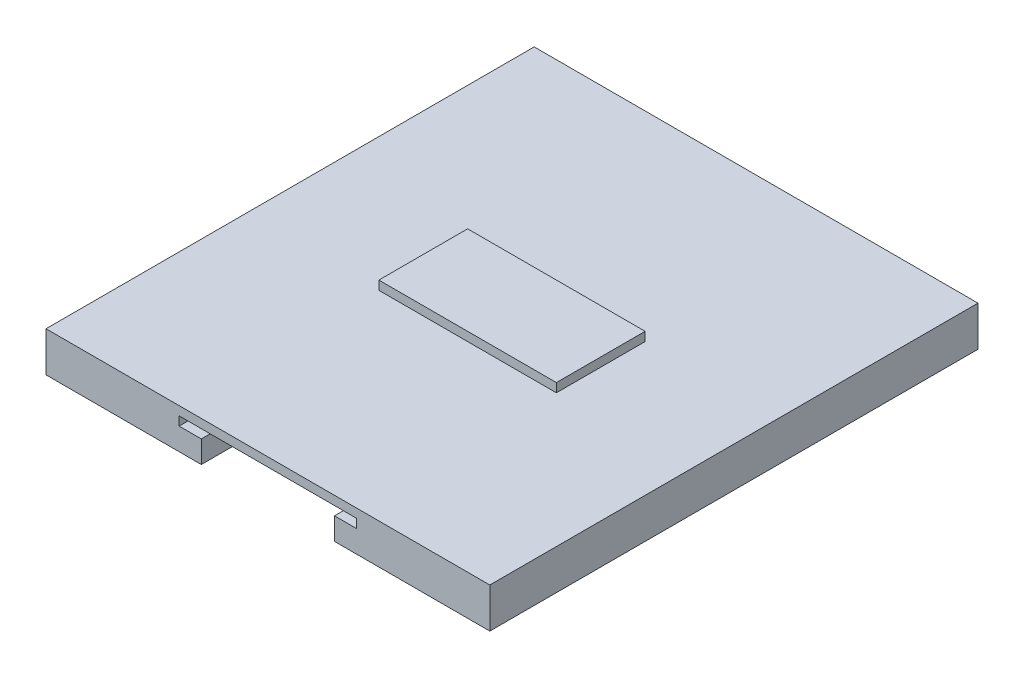
ISO-10303-21;
HEADER;
FILE_DESCRIPTION(('STEP AP214'),'2;1');
FILE_NAME('part.step','',(''),(''),'','','');
FILE_SCHEMA(('AUTOMOTIVE_DESIGN { 1 0 10303 214 1 1 1 1 }'));
ENDSEC;
DATA;
#1=APPLICATION_CONTEXT('core data for automotive mechanical design processes');
#2=APPLICATION_PROTOCOL_DEFINITION('international standard','automotive_design',2000,#1);
#3=PRODUCT_CONTEXT('',#1,'mechanical');
#4=PRODUCT('Part','Part','',(#3));
#5=PRODUCT_RELATED_PRODUCT_CATEGORY('part','',(#4));
#6=PRODUCT_DEFINITION_FORMATION('','',#4);
#7=PRODUCT_DEFINITION_CONTEXT('part definition',#1,'design');
#8=PRODUCT_DEFINITION('design','',#6,#7);
#9=PRODUCT_DEFINITION_SHAPE('','',#8);
#10=(LENGTH_UNIT() NAMED_UNIT(*) SI_UNIT(.MILLI.,.METRE.));
#11=(NAMED_UNIT(*) PLANE_ANGLE_UNIT() SI_UNIT($,.RADIAN.));
#12=(NAMED_UNIT(*) SI_UNIT($,.STERADIAN.) SOLID_ANGLE_UNIT());
#13=UNCERTAINTY_MEASURE_WITH_UNIT(LENGTH_MEASURE(1.E-05),#10,'distance_accuracy_value','');
#14=(GEOMETRIC_REPRESENTATION_CONTEXT(3) GLOBAL_UNCERTAINTY_ASSIGNED_CONTEXT((#13)) GLOBAL_UNIT_ASSIGNED_CONTEXT((#10,
#11,#12)) REPRESENTATION_CONTEXT('',''));
#15=CARTESIAN_POINT('',(0.,0.,0.));
#16=DIRECTION('',(0.,0.,1.));
#17=DIRECTION('',(1.,0.,0.));
#18=AXIS2_PLACEMENT_3D('',#15,#16,#17);
#19=CARTESIAN_POINT('',(-50.,8.99999999999999,55.));
#20=DIRECTION('',(0.,1.,0.));
#21=DIRECTION('',(0.,0.,1.));
#22=AXIS2_PLACEMENT_3D('',#19,#20,#21);
#23=PLANE('',#22);
#24=DIRECTION('',(1.,0.,0.));
#25=VECTOR('',#24,1.);
#26=CARTESIAN_POINT('',(-50.,8.99999999999999,-55.));
#27=LINE('',#26,#25);
#28=CARTESIAN_POINT('',(-50.,8.99999999999999,-55.));
#29=VERTEX_POINT('',#28);
#30=CARTESIAN_POINT('',(50.,8.99999999999999,-55.));
#31=VERTEX_POINT('',#30);
#32=EDGE_CURVE('E256',#29,#31,#27,.T.);
#33=ORIENTED_EDGE('',*,*,#32,.F.);
#34=DIRECTION('',(0.,0.,-1.));
#35=VECTOR('',#34,1.);
#36=CARTESIAN_POINT('',(-50.,8.99999999999999,55.));
#37=LINE('',#36,#35);
#38=CARTESIAN_POINT('',(-50.,8.99999999999999,55.));
#39=VERTEX_POINT('',#38);
#40=EDGE_CURVE('E43',#39,#29,#37,.T.);
#41=ORIENTED_EDGE('',*,*,#40,.F.);
#42=DIRECTION('',(1.,0.,0.));
#43=VECTOR('',#42,1.);
#44=CARTESIAN_POINT('',(-50.,8.99999999999999,55.));
#45=LINE('',#44,#43);
#46=CARTESIAN_POINT('',(50.,8.99999999999999,55.));
#47=VERTEX_POINT('',#46);
#48=EDGE_CURVE('E243',#39,#47,#45,.T.);
#49=ORIENTED_EDGE('',*,*,#48,.T.);
#50=DIRECTION('',(0.,0.,-1.));
#51=VECTOR('',#50,1.);
#52=CARTESIAN_POINT('',(50.,8.99999999999999,55.));
#53=LINE('',#52,#51);
#54=EDGE_CURVE('E265',#47,#31,#53,.T.);
#55=ORIENTED_EDGE('',*,*,#54,.T.);
#56=EDGE_LOOP('',(#33,#41,#49,#55));
#57=FACE_BOUND('',#56,.T.);
#58=DIRECTION('',(1.,0.,0.));
#59=VECTOR('',#58,1.);
#60=CARTESIAN_POINT('',(-20.,8.99999999999999,10.));
#61=LINE('',#60,#59);
#62=CARTESIAN_POINT('',(-20.,8.99999999999999,10.));
#63=VERTEX_POINT('',#62);
#64=CARTESIAN_POINT('',(20.,8.99999999999999,10.));
#65=VERTEX_POINT('',#64);
#66=EDGE_CURVE('E520',#63,#65,#61,.T.);
#67=ORIENTED_EDGE('',*,*,#66,.F.);
#68=DIRECTION('',(0.,0.,1.));
#69=VECTOR('',#68,1.);
#70=CARTESIAN_POINT('',(-20.,8.99999999999999,-10.));
#71=LINE('',#70,#69);
#72=CARTESIAN_POINT('',(-20.,8.99999999999999,-10.));
#73=VERTEX_POINT('',#72);
#74=EDGE_CURVE('E177',#73,#63,#71,.T.);
#75=ORIENTED_EDGE('',*,*,#74,.F.);
#76=DIRECTION('',(-1.,0.,0.));
#77=VECTOR('',#76,1.);
#78=CARTESIAN_POINT('',(-20.,8.99999999999999,-10.));
#79=LINE('',#78,#77);
#80=CARTESIAN_POINT('',(20.,8.99999999999999,-10.));
#81=VERTEX_POINT('',#80);
#82=EDGE_CURVE('E173',#81,#73,#79,.T.);
#83=ORIENTED_EDGE('',*,*,#82,.F.);
#84=DIRECTION('',(0.,0.,-1.));
#85=VECTOR('',#84,1.);
#86=CARTESIAN_POINT('',(20.,8.99999999999999,-10.));
#87=LINE('',#86,#85);
#88=EDGE_CURVE('E517',#65,#81,#87,.T.);
#89=ORIENTED_EDGE('',*,*,#88,.F.);
#90=EDGE_LOOP('',(#67,#75,#83,#89));
#91=FACE_BOUND('',#90,.T.);
#92=ADVANCED_FACE('F39',(#57,#91),#23,.T.);
#93=CARTESIAN_POINT('',(-50.,0.,55.));
#94=DIRECTION('',(0.,-1.,0.));
#95=DIRECTION('',(0.,0.,-1.));
#96=AXIS2_PLACEMENT_3D('',#93,#94,#95);
#97=PLANE('',#96);
#98=DIRECTION('',(0.,0.,-1.));
#99=VECTOR('',#98,1.);
#100=CARTESIAN_POINT('',(-15.,0.,55.));
#101=LINE('',#100,#99);
#102=CARTESIAN_POINT('',(-15.,0.,55.));
#103=VERTEX_POINT('',#102);
#104=CARTESIAN_POINT('',(-15.,0.,-55.));
#105=VERTEX_POINT('',#104);
#106=EDGE_CURVE('E226',#103,#105,#101,.T.);
#107=ORIENTED_EDGE('',*,*,#106,.F.);
#108=DIRECTION('',(-1.,0.,0.));
#109=VECTOR('',#108,1.);
#110=CARTESIAN_POINT('',(-50.,0.,55.));
#111=LINE('',#110,#109);
#112=CARTESIAN_POINT('',(-50.,0.,55.));
#113=VERTEX_POINT('',#112);
#114=EDGE_CURVE('E250',#103,#113,#111,.T.);
#115=ORIENTED_EDGE('',*,*,#114,.T.);
#116=DIRECTION('',(0.,0.,-1.));
#117=VECTOR('',#116,1.);
#118=CARTESIAN_POINT('',(-50.,0.,55.));
#119=LINE('',#118,#117);
#120=CARTESIAN_POINT('',(-50.,0.,-55.));
#121=VERTEX_POINT('',#120);
#122=EDGE_CURVE('E11',#113,#121,#119,.T.);
#123=ORIENTED_EDGE('',*,*,#122,.T.);
#124=DIRECTION('',(-1.,0.,0.));
#125=VECTOR('',#124,1.);
#126=CARTESIAN_POINT('',(-50.,0.,-55.));
#127=LINE('',#126,#125);
#128=EDGE_CURVE('E262',#105,#121,#127,.T.);
#129=ORIENTED_EDGE('',*,*,#128,.F.);
#130=EDGE_LOOP('',(#107,#115,#123,#129));
#131=FACE_BOUND('',#130,.T.);
#132=ADVANCED_FACE('F281',(#131),#97,.T.);
#133=CARTESIAN_POINT('',(-50.,8.99999999999999,55.));
#134=DIRECTION('',(-1.,0.,0.));
#135=DIRECTION('',(0.,0.,1.));
#136=AXIS2_PLACEMENT_3D('',#133,#134,#135);
#137=PLANE('',#136);
#138=DIRECTION('',(0.,1.,0.));
#139=VECTOR('',#138,1.);
#140=CARTESIAN_POINT('',(-50.,8.99999999999999,-55.));
#141=LINE('',#140,#139);
#142=EDGE_CURVE('E225',#121,#29,#141,.T.);
#143=ORIENTED_EDGE('',*,*,#142,.F.);
#144=ORIENTED_EDGE('',*,*,#122,.F.);
#145=DIRECTION('',(0.,1.,0.));
#146=VECTOR('',#145,1.);
#147=CARTESIAN_POINT('',(-50.,8.99999999999999,55.));
#148=LINE('',#147,#146);
#149=EDGE_CURVE('E240',#113,#39,#148,.T.);
#150=ORIENTED_EDGE('',*,*,#149,.T.);
#151=ORIENTED_EDGE('',*,*,#40,.T.);
#152=EDGE_LOOP('',(#143,#144,#150,#151));
#153=FACE_BOUND('',#152,.T.);
#154=ADVANCED_FACE('F41',(#153),#137,.T.);
#155=DIRECTION('',(0.,0.,-1.));
#156=VECTOR('',#155,1.);
#157=CARTESIAN_POINT('',(15.,0.,55.));
#158=LINE('',#157,#156);
#159=CARTESIAN_POINT('',(15.,0.,55.));
#160=VERTEX_POINT('',#159);
#161=CARTESIAN_POINT('',(15.,0.,-55.));
#162=VERTEX_POINT('',#161);
#163=EDGE_CURVE('E228',#160,#162,#158,.T.);
#164=ORIENTED_EDGE('',*,*,#163,.T.);
#165=CARTESIAN_POINT('',(50.,0.,-55.));
#166=VERTEX_POINT('',#165);
#167=EDGE_CURVE('E244',#166,#162,#127,.T.);
#168=ORIENTED_EDGE('',*,*,#167,.F.);
#169=DIRECTION('',(0.,0.,-1.));
#170=VECTOR('',#169,1.);
#171=CARTESIAN_POINT('',(50.,0.,55.));
#172=LINE('',#171,#170);
#173=CARTESIAN_POINT('',(50.,0.,55.));
#174=VERTEX_POINT('',#173);
#175=EDGE_CURVE('E48',#174,#166,#172,.T.);
#176=ORIENTED_EDGE('',*,*,#175,.F.);
#177=EDGE_CURVE('E251',#174,#160,#111,.T.);
#178=ORIENTED_EDGE('',*,*,#177,.T.);
#179=EDGE_LOOP('',(#164,#168,#176,#178));
#180=FACE_BOUND('',#179,.T.);
#181=ADVANCED_FACE('F292',(#180),#97,.T.);
#182=CARTESIAN_POINT('',(50.,8.99999999999999,55.));
#183=DIRECTION('',(1.,0.,0.));
#184=DIRECTION('',(0.,0.,-1.));
#185=AXIS2_PLACEMENT_3D('',#182,#183,#184);
#186=PLANE('',#185);
#187=DIRECTION('',(0.,-1.,0.));
#188=VECTOR('',#187,1.);
#189=CARTESIAN_POINT('',(50.,8.99999999999999,-55.));
#190=LINE('',#189,#188);
#191=EDGE_CURVE('E259',#31,#166,#190,.T.);
#192=ORIENTED_EDGE('',*,*,#191,.F.);
#193=ORIENTED_EDGE('',*,*,#54,.F.);
#194=DIRECTION('',(0.,-1.,0.));
#195=VECTOR('',#194,1.);
#196=CARTESIAN_POINT('',(50.,8.99999999999999,55.));
#197=LINE('',#196,#195);
#198=EDGE_CURVE('E247',#47,#174,#197,.T.);
#199=ORIENTED_EDGE('',*,*,#198,.T.);
#200=ORIENTED_EDGE('',*,*,#175,.T.);
#201=EDGE_LOOP('',(#192,#193,#199,#200));
#202=FACE_BOUND('',#201,.T.);
#203=ADVANCED_FACE('F288',(#202),#186,.T.);
#204=CARTESIAN_POINT('',(-50.,0.,55.));
#205=DIRECTION('',(0.,0.,1.));
#206=DIRECTION('',(1.,0.,0.));
#207=AXIS2_PLACEMENT_3D('',#204,#205,#206);
#208=PLANE('',#207);
#209=DIRECTION('',(0.,1.,0.));
#210=VECTOR('',#209,1.);
#211=CARTESIAN_POINT('',(-15.,0.,55.));
#212=LINE('',#211,#210);
#213=CARTESIAN_POINT('',(-15.,5.,55.));
#214=VERTEX_POINT('',#213);
#215=EDGE_CURVE('E204',#103,#214,#212,.T.);
#216=ORIENTED_EDGE('',*,*,#215,.T.);
#217=DIRECTION('',(-1.,0.,0.));
#218=VECTOR('',#217,1.);
#219=CARTESIAN_POINT('',(-15.,5.,55.));
#220=LINE('',#219,#218);
#221=CARTESIAN_POINT('',(-20.,5.,55.));
#222=VERTEX_POINT('',#221);
#223=EDGE_CURVE('E185',#214,#222,#220,.T.);
#224=ORIENTED_EDGE('',*,*,#223,.T.);
#225=DIRECTION('',(0.,1.,0.));
#226=VECTOR('',#225,1.);
#227=CARTESIAN_POINT('',(-20.,5.,55.));
#228=LINE('',#227,#226);
#229=CARTESIAN_POINT('',(-20.,7.,55.));
#230=VERTEX_POINT('',#229);
#231=EDGE_CURVE('E188',#222,#230,#228,.T.);
#232=ORIENTED_EDGE('',*,*,#231,.T.);
#233=DIRECTION('',(1.,0.,0.));
#234=VECTOR('',#233,1.);
#235=CARTESIAN_POINT('',(-20.,7.,55.));
#236=LINE('',#235,#234);
#237=CARTESIAN_POINT('',(20.,7.,55.));
#238=VERTEX_POINT('',#237);
#239=EDGE_CURVE('E192',#230,#238,#236,.T.);
#240=ORIENTED_EDGE('',*,*,#239,.T.);
#241=DIRECTION('',(0.,-1.,0.));
#242=VECTOR('',#241,1.);
#243=CARTESIAN_POINT('',(20.,7.,55.));
#244=LINE('',#243,#242);
#245=CARTESIAN_POINT('',(20.,5.,55.));
#246=VERTEX_POINT('',#245);
#247=EDGE_CURVE('E195',#238,#246,#244,.T.);
#248=ORIENTED_EDGE('',*,*,#247,.T.);
#249=DIRECTION('',(-1.,0.,0.));
#250=VECTOR('',#249,1.);
#251=CARTESIAN_POINT('',(20.,5.,55.));
#252=LINE('',#251,#250);
#253=CARTESIAN_POINT('',(15.,5.,55.));
#254=VERTEX_POINT('',#253);
#255=EDGE_CURVE('E198',#246,#254,#252,.T.);
#256=ORIENTED_EDGE('',*,*,#255,.T.);
#257=DIRECTION('',(0.,-1.,0.));
#258=VECTOR('',#257,1.);
#259=CARTESIAN_POINT('',(15.,5.,55.));
#260=LINE('',#259,#258);
#261=EDGE_CURVE('E201',#254,#160,#260,.T.);
#262=ORIENTED_EDGE('',*,*,#261,.T.);
#263=ORIENTED_EDGE('',*,*,#177,.F.);
#264=ORIENTED_EDGE('',*,*,#198,.F.);
#265=ORIENTED_EDGE('',*,*,#48,.F.);
#266=ORIENTED_EDGE('',*,*,#149,.F.);
#267=ORIENTED_EDGE('',*,*,#114,.F.);
#268=EDGE_LOOP('',(#216,#224,#232,#240,#248,#256,#262,#263,#264,#265,#266,#267));
#269=FACE_BOUND('',#268,.T.);
#270=ADVANCED_FACE('F284',(#269),#208,.T.);
#271=CARTESIAN_POINT('',(-50.,0.,-55.));
#272=DIRECTION('',(0.,0.,1.));
#273=DIRECTION('',(1.,0.,0.));
#274=AXIS2_PLACEMENT_3D('',#271,#272,#273);
#275=PLANE('',#274);
#276=DIRECTION('',(-1.,0.,0.));
#277=VECTOR('',#276,1.);
#278=CARTESIAN_POINT('',(-15.,5.,-55.));
#279=LINE('',#278,#277);
#280=CARTESIAN_POINT('',(-15.,5.,-55.));
#281=VERTEX_POINT('',#280);
#282=CARTESIAN_POINT('',(-20.,5.,-55.));
#283=VERTEX_POINT('',#282);
#284=EDGE_CURVE('E64',#281,#283,#279,.T.);
#285=ORIENTED_EDGE('',*,*,#284,.F.);
#286=DIRECTION('',(0.,1.,0.));
#287=VECTOR('',#286,1.);
#288=CARTESIAN_POINT('',(-15.,0.,-55.));
#289=LINE('',#288,#287);
#290=EDGE_CURVE('E189',#105,#281,#289,.T.);
#291=ORIENTED_EDGE('',*,*,#290,.F.);
#292=ORIENTED_EDGE('',*,*,#128,.T.);
#293=ORIENTED_EDGE('',*,*,#142,.T.);
#294=ORIENTED_EDGE('',*,*,#32,.T.);
#295=ORIENTED_EDGE('',*,*,#191,.T.);
#296=ORIENTED_EDGE('',*,*,#167,.T.);
#297=DIRECTION('',(0.,-1.,0.));
#298=VECTOR('',#297,1.);
#299=CARTESIAN_POINT('',(15.,5.,-55.));
#300=LINE('',#299,#298);
#301=CARTESIAN_POINT('',(15.,5.,-55.));
#302=VERTEX_POINT('',#301);
#303=EDGE_CURVE('E219',#302,#162,#300,.T.);
#304=ORIENTED_EDGE('',*,*,#303,.F.);
#305=DIRECTION('',(-1.,0.,0.));
#306=VECTOR('',#305,1.);
#307=CARTESIAN_POINT('',(20.,5.,-55.));
#308=LINE('',#307,#306);
#309=CARTESIAN_POINT('',(20.,5.,-55.));
#310=VERTEX_POINT('',#309);
#311=EDGE_CURVE('E216',#310,#302,#308,.T.);
#312=ORIENTED_EDGE('',*,*,#311,.F.);
#313=DIRECTION('',(0.,-1.,0.));
#314=VECTOR('',#313,1.);
#315=CARTESIAN_POINT('',(20.,7.,-55.));
#316=LINE('',#315,#314);
#317=CARTESIAN_POINT('',(20.,7.,-55.));
#318=VERTEX_POINT('',#317);
#319=EDGE_CURVE('E213',#318,#310,#316,.T.);
#320=ORIENTED_EDGE('',*,*,#319,.F.);
#321=DIRECTION('',(1.,0.,0.));
#322=VECTOR('',#321,1.);
#323=CARTESIAN_POINT('',(-20.,7.,-55.));
#324=LINE('',#323,#322);
#325=CARTESIAN_POINT('',(-20.,7.,-55.));
#326=VERTEX_POINT('',#325);
#327=EDGE_CURVE('E210',#326,#318,#324,.T.);
#328=ORIENTED_EDGE('',*,*,#327,.F.);
#329=DIRECTION('',(0.,1.,0.));
#330=VECTOR('',#329,1.);
#331=CARTESIAN_POINT('',(-20.,5.,-55.));
#332=LINE('',#331,#330);
#333=EDGE_CURVE('E180',#283,#326,#332,.T.);
#334=ORIENTED_EDGE('',*,*,#333,.F.);
#335=EDGE_LOOP('',(#285,#291,#292,#293,#294,#295,#296,#304,#312,#320,#328,#334));
#336=FACE_BOUND('',#335,.T.);
#337=ADVANCED_FACE('F276',(#336),#275,.F.);
#338=CARTESIAN_POINT('',(-15.,5.,55.));
#339=DIRECTION('',(0.,-1.,0.));
#340=DIRECTION('',(1.,0.,0.));
#341=AXIS2_PLACEMENT_3D('',#338,#339,#340);
#342=PLANE('',#341);
#343=ORIENTED_EDGE('',*,*,#284,.T.);
#344=DIRECTION('',(0.,0.,-1.));
#345=VECTOR('',#344,1.);
#346=CARTESIAN_POINT('',(-20.,5.,55.));
#347=LINE('',#346,#345);
#348=EDGE_CURVE('E206',#222,#283,#347,.T.);
#349=ORIENTED_EDGE('',*,*,#348,.F.);
#350=ORIENTED_EDGE('',*,*,#223,.F.);
#351=DIRECTION('',(0.,0.,-1.));
#352=VECTOR('',#351,1.);
#353=CARTESIAN_POINT('',(-15.,5.,55.));
#354=LINE('',#353,#352);
#355=EDGE_CURVE('E223',#214,#281,#354,.T.);
#356=ORIENTED_EDGE('',*,*,#355,.T.);
#357=EDGE_LOOP('',(#343,#349,#350,#356));
#358=FACE_BOUND('',#357,.T.);
#359=ADVANCED_FACE('F313',(#358),#342,.F.);
#360=CARTESIAN_POINT('',(-15.,0.,55.));
#361=DIRECTION('',(-1.,0.,0.));
#362=DIRECTION('',(0.,-1.,0.));
#363=AXIS2_PLACEMENT_3D('',#360,#361,#362);
#364=PLANE('',#363);
#365=ORIENTED_EDGE('',*,*,#290,.T.);
#366=ORIENTED_EDGE('',*,*,#355,.F.);
#367=ORIENTED_EDGE('',*,*,#215,.F.);
#368=ORIENTED_EDGE('',*,*,#106,.T.);
#369=EDGE_LOOP('',(#365,#366,#367,#368));
#370=FACE_BOUND('',#369,.T.);
#371=ADVANCED_FACE('F315',(#370),#364,.F.);
#372=CARTESIAN_POINT('',(15.,5.,55.));
#373=DIRECTION('',(1.,0.,0.));
#374=DIRECTION('',(0.,1.,0.));
#375=AXIS2_PLACEMENT_3D('',#372,#373,#374);
#376=PLANE('',#375);
#377=ORIENTED_EDGE('',*,*,#303,.T.);
#378=ORIENTED_EDGE('',*,*,#163,.F.);
#379=ORIENTED_EDGE('',*,*,#261,.F.);
#380=DIRECTION('',(0.,0.,-1.));
#381=VECTOR('',#380,1.);
#382=CARTESIAN_POINT('',(15.,5.,55.));
#383=LINE('',#382,#381);
#384=EDGE_CURVE('E231',#254,#302,#383,.T.);
#385=ORIENTED_EDGE('',*,*,#384,.T.);
#386=EDGE_LOOP('',(#377,#378,#379,#385));
#387=FACE_BOUND('',#386,.T.);
#388=ADVANCED_FACE('F295',(#387),#376,.F.);
#389=CARTESIAN_POINT('',(20.,5.,55.));
#390=DIRECTION('',(0.,-1.,0.));
#391=DIRECTION('',(1.,0.,0.));
#392=AXIS2_PLACEMENT_3D('',#389,#390,#391);
#393=PLANE('',#392);
#394=ORIENTED_EDGE('',*,*,#311,.T.);
#395=ORIENTED_EDGE('',*,*,#384,.F.);
#396=ORIENTED_EDGE('',*,*,#255,.F.);
#397=DIRECTION('',(0.,0.,-1.));
#398=VECTOR('',#397,1.);
#399=CARTESIAN_POINT('',(20.,5.,55.));
#400=LINE('',#399,#398);
#401=EDGE_CURVE('E233',#246,#310,#400,.T.);
#402=ORIENTED_EDGE('',*,*,#401,.T.);
#403=EDGE_LOOP('',(#394,#395,#396,#402));
#404=FACE_BOUND('',#403,.T.);
#405=ADVANCED_FACE('F299',(#404),#393,.F.);
#406=CARTESIAN_POINT('',(20.,7.,55.));
#407=DIRECTION('',(1.,0.,0.));
#408=DIRECTION('',(0.,1.,0.));
#409=AXIS2_PLACEMENT_3D('',#406,#407,#408);
#410=PLANE('',#409);
#411=ORIENTED_EDGE('',*,*,#319,.T.);
#412=ORIENTED_EDGE('',*,*,#401,.F.);
#413=ORIENTED_EDGE('',*,*,#247,.F.);
#414=DIRECTION('',(0.,0.,-1.));
#415=VECTOR('',#414,1.);
#416=CARTESIAN_POINT('',(20.,7.,55.));
#417=LINE('',#416,#415);
#418=EDGE_CURVE('E235',#238,#318,#417,.T.);
#419=ORIENTED_EDGE('',*,*,#418,.T.);
#420=EDGE_LOOP('',(#411,#412,#413,#419));
#421=FACE_BOUND('',#420,.T.);
#422=ADVANCED_FACE('F305',(#421),#410,.F.);
#423=CARTESIAN_POINT('',(-20.,7.,55.));
#424=DIRECTION('',(0.,1.,0.));
#425=DIRECTION('',(0.,0.,1.));
#426=AXIS2_PLACEMENT_3D('',#423,#424,#425);
#427=PLANE('',#426);
#428=ORIENTED_EDGE('',*,*,#327,.T.);
#429=ORIENTED_EDGE('',*,*,#418,.F.);
#430=ORIENTED_EDGE('',*,*,#239,.F.);
#431=DIRECTION('',(0.,0.,-1.));
#432=VECTOR('',#431,1.);
#433=CARTESIAN_POINT('',(-20.,7.,55.));
#434=LINE('',#433,#432);
#435=EDGE_CURVE('E237',#230,#326,#434,.T.);
#436=ORIENTED_EDGE('',*,*,#435,.T.);
#437=EDGE_LOOP('',(#428,#429,#430,#436));
#438=FACE_BOUND('',#437,.T.);
#439=ADVANCED_FACE('F308',(#438),#427,.F.);
#440=CARTESIAN_POINT('',(-20.,5.,55.));
#441=DIRECTION('',(-1.,0.,0.));
#442=DIRECTION('',(0.,0.,1.));
#443=AXIS2_PLACEMENT_3D('',#440,#441,#442);
#444=PLANE('',#443);
#445=ORIENTED_EDGE('',*,*,#333,.T.);
#446=ORIENTED_EDGE('',*,*,#435,.F.);
#447=ORIENTED_EDGE('',*,*,#231,.F.);
#448=ORIENTED_EDGE('',*,*,#348,.T.);
#449=EDGE_LOOP('',(#445,#446,#447,#448));
#450=FACE_BOUND('',#449,.T.);
#451=ADVANCED_FACE('F311',(#450),#444,.F.);
#452=CARTESIAN_POINT('',(-20.,11.,-10.));
#453=DIRECTION('',(1.,0.,0.));
#454=DIRECTION('',(0.,0.,-1.));
#455=AXIS2_PLACEMENT_3D('',#452,#453,#454);
#456=PLANE('',#455);
#457=ORIENTED_EDGE('',*,*,#74,.T.);
#458=DIRECTION('',(0.,-1.,0.));
#459=VECTOR('',#458,1.);
#460=CARTESIAN_POINT('',(-20.,11.,10.));
#461=LINE('',#460,#459);
#462=CARTESIAN_POINT('',(-20.,11.,10.));
#463=VERTEX_POINT('',#462);
#464=EDGE_CURVE('E158',#463,#63,#461,.T.);
#465=ORIENTED_EDGE('',*,*,#464,.F.);
#466=DIRECTION('',(0.,0.,1.));
#467=VECTOR('',#466,1.);
#468=CARTESIAN_POINT('',(-20.,11.,-10.));
#469=LINE('',#468,#467);
#470=CARTESIAN_POINT('',(-20.,11.,-10.));
#471=VERTEX_POINT('',#470);
#472=EDGE_CURVE('E165',#471,#463,#469,.T.);
#473=ORIENTED_EDGE('',*,*,#472,.F.);
#474=DIRECTION('',(0.,-1.,0.));
#475=VECTOR('',#474,1.);
#476=CARTESIAN_POINT('',(-20.,11.,-10.));
#477=LINE('',#476,#475);
#478=EDGE_CURVE('E515',#471,#73,#477,.T.);
#479=ORIENTED_EDGE('',*,*,#478,.T.);
#480=EDGE_LOOP('',(#457,#465,#473,#479));
#481=FACE_BOUND('',#480,.T.);
#482=ADVANCED_FACE('F175',(#481),#456,.F.);
#483=CARTESIAN_POINT('',(-20.,11.,10.));
#484=DIRECTION('',(0.,0.,-1.));
#485=DIRECTION('',(-1.,0.,0.));
#486=AXIS2_PLACEMENT_3D('',#483,#484,#485);
#487=PLANE('',#486);
#488=ORIENTED_EDGE('',*,*,#66,.T.);
#489=DIRECTION('',(0.,-1.,0.));
#490=VECTOR('',#489,1.);
#491=CARTESIAN_POINT('',(20.,11.,10.));
#492=LINE('',#491,#490);
#493=CARTESIAN_POINT('',(20.,11.,10.));
#494=VERTEX_POINT('',#493);
#495=EDGE_CURVE('E161',#494,#65,#492,.T.);
#496=ORIENTED_EDGE('',*,*,#495,.F.);
#497=DIRECTION('',(1.,0.,0.));
#498=VECTOR('',#497,1.);
#499=CARTESIAN_POINT('',(-20.,11.,10.));
#500=LINE('',#499,#498);
#501=EDGE_CURVE('E154',#463,#494,#500,.T.);
#502=ORIENTED_EDGE('',*,*,#501,.F.);
#503=ORIENTED_EDGE('',*,*,#464,.T.);
#504=EDGE_LOOP('',(#488,#496,#502,#503));
#505=FACE_BOUND('',#504,.T.);
#506=ADVANCED_FACE('F156',(#505),#487,.F.);
#507=CARTESIAN_POINT('',(20.,11.,-10.));
#508=DIRECTION('',(-1.,0.,0.));
#509=DIRECTION('',(0.,0.,1.));
#510=AXIS2_PLACEMENT_3D('',#507,#508,#509);
#511=PLANE('',#510);
#512=ORIENTED_EDGE('',*,*,#88,.T.);
#513=DIRECTION('',(0.,-1.,0.));
#514=VECTOR('',#513,1.);
#515=CARTESIAN_POINT('',(20.,11.,-10.));
#516=LINE('',#515,#514);
#517=CARTESIAN_POINT('',(20.,11.,-10.));
#518=VERTEX_POINT('',#517);
#519=EDGE_CURVE('E56',#518,#81,#516,.T.);
#520=ORIENTED_EDGE('',*,*,#519,.F.);
#521=DIRECTION('',(0.,0.,-1.));
#522=VECTOR('',#521,1.);
#523=CARTESIAN_POINT('',(20.,11.,-10.));
#524=LINE('',#523,#522);
#525=EDGE_CURVE('E164',#494,#518,#524,.T.);
#526=ORIENTED_EDGE('',*,*,#525,.F.);
#527=ORIENTED_EDGE('',*,*,#495,.T.);
#528=EDGE_LOOP('',(#512,#520,#526,#527));
#529=FACE_BOUND('',#528,.T.);
#530=ADVANCED_FACE('F373',(#529),#511,.F.);
#531=CARTESIAN_POINT('',(-20.,11.,-10.));
#532=DIRECTION('',(0.,0.,1.));
#533=DIRECTION('',(1.,0.,0.));
#534=AXIS2_PLACEMENT_3D('',#531,#532,#533);
#535=PLANE('',#534);
#536=ORIENTED_EDGE('',*,*,#82,.T.);
#537=ORIENTED_EDGE('',*,*,#478,.F.);
#538=DIRECTION('',(-1.,0.,0.));
#539=VECTOR('',#538,1.);
#540=CARTESIAN_POINT('',(-20.,11.,-10.));
#541=LINE('',#540,#539);
#542=EDGE_CURVE('E169',#518,#471,#541,.T.);
#543=ORIENTED_EDGE('',*,*,#542,.F.);
#544=ORIENTED_EDGE('',*,*,#519,.T.);
#545=EDGE_LOOP('',(#536,#537,#543,#544));
#546=FACE_BOUND('',#545,.T.);
#547=ADVANCED_FACE('F380',(#546),#535,.F.);
#548=CARTESIAN_POINT('',(-20.,11.,10.));
#549=DIRECTION('',(0.,1.,0.));
#550=DIRECTION('',(0.,0.,1.));
#551=AXIS2_PLACEMENT_3D('',#548,#549,#550);
#552=PLANE('',#551);
#553=ORIENTED_EDGE('',*,*,#472,.T.);
#554=ORIENTED_EDGE('',*,*,#501,.T.);
#555=ORIENTED_EDGE('',*,*,#525,.T.);
#556=ORIENTED_EDGE('',*,*,#542,.T.);
#557=EDGE_LOOP('',(#553,#554,#555,#556));
#558=FACE_BOUND('',#557,.T.);
#559=ADVANCED_FACE('F168',(#558),#552,.T.);
#560=CLOSED_SHELL('',(#92,#132,#154,#181,#203,#270,#337,#359,#371,#388,#405,#422,#439,#451,#482,
#506,#530,#547,#559));
#561=MANIFOLD_SOLID_BREP('B2',#560);
#562=ADVANCED_BREP_SHAPE_REPRESENTATION('',(#18,#561),#14);
#563=SHAPE_DEFINITION_REPRESENTATION(#9,#562);
ENDSEC;
END-ISO-10303-21;
